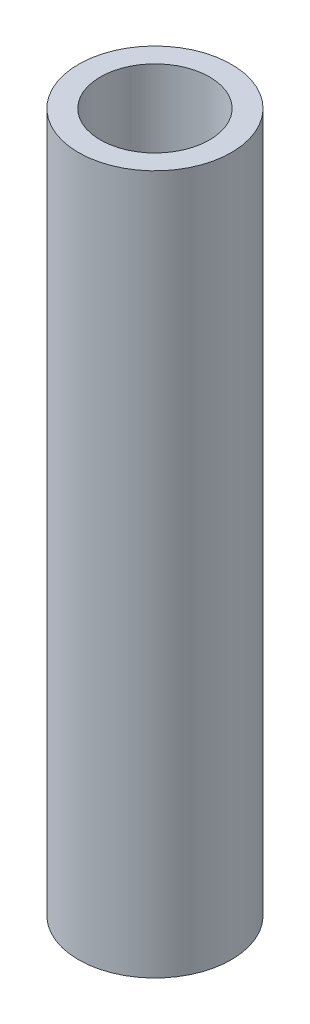
ISO-10303-21;
HEADER;
FILE_DESCRIPTION(('STEP AP214'),'2;1');
FILE_NAME('part.step','',(''),(''),'','','');
FILE_SCHEMA(('AUTOMOTIVE_DESIGN { 1 0 10303 214 1 1 1 1 }'));
ENDSEC;
DATA;
#1=APPLICATION_CONTEXT('core data for automotive mechanical design processes');
#2=APPLICATION_PROTOCOL_DEFINITION('international standard','automotive_design',2000,#1);
#3=PRODUCT_CONTEXT('',#1,'mechanical');
#4=PRODUCT('Part','Part','',(#3));
#5=PRODUCT_RELATED_PRODUCT_CATEGORY('part','',(#4));
#6=PRODUCT_DEFINITION_FORMATION('','',#4);
#7=PRODUCT_DEFINITION_CONTEXT('part definition',#1,'design');
#8=PRODUCT_DEFINITION('design','',#6,#7);
#9=PRODUCT_DEFINITION_SHAPE('','',#8);
#10=(LENGTH_UNIT() NAMED_UNIT(*) SI_UNIT(.MILLI.,.METRE.));
#11=(NAMED_UNIT(*) PLANE_ANGLE_UNIT() SI_UNIT($,.RADIAN.));
#12=(NAMED_UNIT(*) SI_UNIT($,.STERADIAN.) SOLID_ANGLE_UNIT());
#13=UNCERTAINTY_MEASURE_WITH_UNIT(LENGTH_MEASURE(1.E-05),#10,'distance_accuracy_value','');
#14=(GEOMETRIC_REPRESENTATION_CONTEXT(3) GLOBAL_UNCERTAINTY_ASSIGNED_CONTEXT((#13)) GLOBAL_UNIT_ASSIGNED_CONTEXT((#10,
#11,#12)) REPRESENTATION_CONTEXT('',''));
#15=CARTESIAN_POINT('',(0.,0.,0.));
#16=DIRECTION('',(0.,0.,1.));
#17=DIRECTION('',(1.,0.,0.));
#18=AXIS2_PLACEMENT_3D('',#15,#16,#17);
#19=CARTESIAN_POINT('',(0.,32.,0.));
#20=DIRECTION('',(0.,-1.,0.));
#21=DIRECTION('',(0.,0.,-1.));
#22=AXIS2_PLACEMENT_3D('',#19,#20,#21);
#23=CYLINDRICAL_SURFACE('',#22,3.5);
#24=CARTESIAN_POINT('',(0.,32.,0.));
#25=DIRECTION('',(0.,1.,0.));
#26=DIRECTION('',(0.,0.,1.));
#27=AXIS2_PLACEMENT_3D('',#24,#25,#26);
#28=CIRCLE('',#27,3.5);
#29=CARTESIAN_POINT('',(0.,32.,3.5));
#30=VERTEX_POINT('',#29);
#31=EDGE_CURVE('E10',#30,#30,#28,.T.);
#32=ORIENTED_EDGE('',*,*,#31,.F.);
#33=EDGE_LOOP('',(#32));
#34=FACE_BOUND('',#33,.T.);
#35=CARTESIAN_POINT('',(0.,0.,0.));
#36=DIRECTION('',(0.,1.,0.));
#37=DIRECTION('',(0.,0.,1.));
#38=AXIS2_PLACEMENT_3D('',#35,#36,#37);
#39=CIRCLE('',#38,3.5);
#40=CARTESIAN_POINT('',(0.,0.,3.5));
#41=VERTEX_POINT('',#40);
#42=EDGE_CURVE('E36',#41,#41,#39,.T.);
#43=ORIENTED_EDGE('',*,*,#42,.T.);
#44=EDGE_LOOP('',(#43));
#45=FACE_BOUND('',#44,.T.);
#46=ADVANCED_FACE('F33',(#34,#45),#23,.T.);
#47=CARTESIAN_POINT('',(0.,32.,0.));
#48=DIRECTION('',(0.,1.,0.));
#49=DIRECTION('',(0.,0.,1.));
#50=AXIS2_PLACEMENT_3D('',#47,#48,#49);
#51=PLANE('',#50);
#52=CARTESIAN_POINT('',(0.,32.,0.));
#53=DIRECTION('',(0.,-1.,0.));
#54=DIRECTION('',(0.,0.,-1.));
#55=AXIS2_PLACEMENT_3D('',#52,#53,#54);
#56=CIRCLE('',#55,2.5);
#57=CARTESIAN_POINT('',(0.,32.,-2.5));
#58=VERTEX_POINT('',#57);
#59=EDGE_CURVE('E43',#58,#58,#56,.T.);
#60=ORIENTED_EDGE('',*,*,#59,.T.);
#61=EDGE_LOOP('',(#60));
#62=FACE_BOUND('',#61,.T.);
#63=ORIENTED_EDGE('',*,*,#31,.T.);
#64=EDGE_LOOP('',(#63));
#65=FACE_BOUND('',#64,.T.);
#66=ADVANCED_FACE('F51',(#62,#65),#51,.T.);
#67=CARTESIAN_POINT('',(0.,0.,0.));
#68=DIRECTION('',(0.,1.,0.));
#69=DIRECTION('',(0.,0.,1.));
#70=AXIS2_PLACEMENT_3D('',#67,#68,#69);
#71=PLANE('',#70);
#72=CARTESIAN_POINT('',(0.,0.,0.));
#73=DIRECTION('',(0.,-1.,0.));
#74=DIRECTION('',(0.,0.,-1.));
#75=AXIS2_PLACEMENT_3D('',#72,#73,#74);
#76=CIRCLE('',#75,2.5);
#77=CARTESIAN_POINT('',(0.,0.,-2.5));
#78=VERTEX_POINT('',#77);
#79=EDGE_CURVE('E45',#78,#78,#76,.T.);
#80=ORIENTED_EDGE('',*,*,#79,.F.);
#81=EDGE_LOOP('',(#80));
#82=FACE_BOUND('',#81,.T.);
#83=ORIENTED_EDGE('',*,*,#42,.F.);
#84=EDGE_LOOP('',(#83));
#85=FACE_BOUND('',#84,.T.);
#86=ADVANCED_FACE('F56',(#82,#85),#71,.F.);
#87=CARTESIAN_POINT('',(0.,32.,0.));
#88=DIRECTION('',(0.,-1.,0.));
#89=DIRECTION('',(0.,0.,-1.));
#90=AXIS2_PLACEMENT_3D('',#87,#88,#89);
#91=CYLINDRICAL_SURFACE('',#90,2.5);
#92=ORIENTED_EDGE('',*,*,#59,.F.);
#93=EDGE_LOOP('',(#92));
#94=FACE_BOUND('',#93,.T.);
#95=ORIENTED_EDGE('',*,*,#79,.T.);
#96=EDGE_LOOP('',(#95));
#97=FACE_BOUND('',#96,.T.);
#98=ADVANCED_FACE('F53',(#94,#97),#91,.F.);
#99=CLOSED_SHELL('',(#46,#66,#86,#98));
#100=MANIFOLD_SOLID_BREP('B2',#99);
#101=ADVANCED_BREP_SHAPE_REPRESENTATION('',(#18,#100),#14);
#102=SHAPE_DEFINITION_REPRESENTATION(#9,#101);
ENDSEC;
END-ISO-10303-21;
